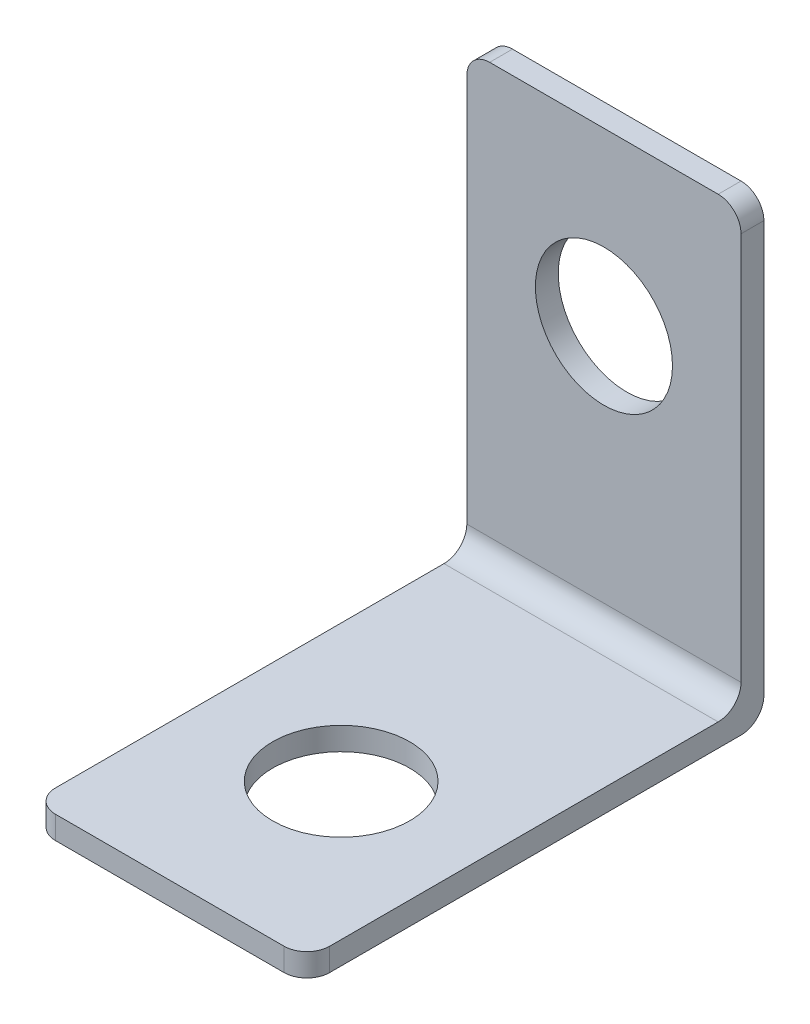
ISO-10303-21;
HEADER;
FILE_DESCRIPTION(('STEP AP214'),'2;1');
FILE_NAME('part.step','',(''),(''),'','','');
FILE_SCHEMA(('AUTOMOTIVE_DESIGN { 1 0 10303 214 1 1 1 1 }'));
ENDSEC;
DATA;
#1=APPLICATION_CONTEXT('core data for automotive mechanical design processes');
#2=APPLICATION_PROTOCOL_DEFINITION('international standard','automotive_design',2000,#1);
#3=PRODUCT_CONTEXT('',#1,'mechanical');
#4=PRODUCT('Part','Part','',(#3));
#5=PRODUCT_RELATED_PRODUCT_CATEGORY('part','',(#4));
#6=PRODUCT_DEFINITION_FORMATION('','',#4);
#7=PRODUCT_DEFINITION_CONTEXT('part definition',#1,'design');
#8=PRODUCT_DEFINITION('design','',#6,#7);
#9=PRODUCT_DEFINITION_SHAPE('','',#8);
#10=(LENGTH_UNIT() NAMED_UNIT(*) SI_UNIT(.MILLI.,.METRE.));
#11=(NAMED_UNIT(*) PLANE_ANGLE_UNIT() SI_UNIT($,.RADIAN.));
#12=(NAMED_UNIT(*) SI_UNIT($,.STERADIAN.) SOLID_ANGLE_UNIT());
#13=UNCERTAINTY_MEASURE_WITH_UNIT(LENGTH_MEASURE(1.E-05),#10,'distance_accuracy_value','');
#14=(GEOMETRIC_REPRESENTATION_CONTEXT(3) GLOBAL_UNCERTAINTY_ASSIGNED_CONTEXT((#13)) GLOBAL_UNIT_ASSIGNED_CONTEXT((#10,
#11,#12)) REPRESENTATION_CONTEXT('',''));
#15=CARTESIAN_POINT('',(0.,0.,0.));
#16=DIRECTION('',(0.,0.,1.));
#17=DIRECTION('',(1.,0.,0.));
#18=AXIS2_PLACEMENT_3D('',#15,#16,#17);
#19=CARTESIAN_POINT('',(0.,0.,1.));
#20=DIRECTION('',(0.,0.,-1.));
#21=DIRECTION('',(-1.,0.,0.));
#22=AXIS2_PLACEMENT_3D('',#19,#20,#21);
#23=PLANE('',#22);
#24=CARTESIAN_POINT('',(0.,12.5,1.));
#25=DIRECTION('',(0.,0.,1.));
#26=DIRECTION('',(1.,0.,0.));
#27=AXIS2_PLACEMENT_3D('',#24,#25,#26);
#28=CIRCLE('',#27,3.);
#29=CARTESIAN_POINT('',(3.,12.5,1.));
#30=VERTEX_POINT('',#29);
#31=EDGE_CURVE('E253',#30,#30,#28,.T.);
#32=ORIENTED_EDGE('',*,*,#31,.F.);
#33=EDGE_LOOP('',(#32));
#34=FACE_BOUND('',#33,.T.);
#35=DIRECTION('',(0.,1.,0.));
#36=VECTOR('',#35,1.);
#37=CARTESIAN_POINT('',(6.,0.,1.));
#38=LINE('',#37,#36);
#39=CARTESIAN_POINT('',(6.,2.,1.));
#40=VERTEX_POINT('',#39);
#41=CARTESIAN_POINT('',(6.,19.,1.));
#42=VERTEX_POINT('',#41);
#43=EDGE_CURVE('E264',#40,#42,#38,.T.);
#44=ORIENTED_EDGE('',*,*,#43,.T.);
#45=CARTESIAN_POINT('',(5.,19.,1.));
#46=DIRECTION('',(0.,0.,-1.));
#47=DIRECTION('',(-1.,0.,0.));
#48=AXIS2_PLACEMENT_3D('',#45,#46,#47);
#49=CIRCLE('',#48,1.);
#50=CARTESIAN_POINT('',(5.,20.,1.));
#51=VERTEX_POINT('',#50);
#52=EDGE_CURVE('E203',#42,#51,#49,.F.);
#53=ORIENTED_EDGE('',*,*,#52,.T.);
#54=DIRECTION('',(-1.,0.,0.));
#55=VECTOR('',#54,1.);
#56=CARTESIAN_POINT('',(-6.,20.,1.));
#57=LINE('',#56,#55);
#58=CARTESIAN_POINT('',(-5.,20.,1.));
#59=VERTEX_POINT('',#58);
#60=EDGE_CURVE('E269',#51,#59,#57,.T.);
#61=ORIENTED_EDGE('',*,*,#60,.T.);
#62=CARTESIAN_POINT('',(-5.,19.,1.));
#63=DIRECTION('',(0.,0.,-1.));
#64=DIRECTION('',(-1.,0.,0.));
#65=AXIS2_PLACEMENT_3D('',#62,#63,#64);
#66=CIRCLE('',#65,1.);
#67=CARTESIAN_POINT('',(-6.,19.,1.));
#68=VERTEX_POINT('',#67);
#69=EDGE_CURVE('E200',#59,#68,#66,.F.);
#70=ORIENTED_EDGE('',*,*,#69,.T.);
#71=DIRECTION('',(0.,-1.,0.));
#72=VECTOR('',#71,1.);
#73=CARTESIAN_POINT('',(-6.,0.,1.));
#74=LINE('',#73,#72);
#75=CARTESIAN_POINT('',(-6.,2.,1.));
#76=VERTEX_POINT('',#75);
#77=EDGE_CURVE('E261',#68,#76,#74,.T.);
#78=ORIENTED_EDGE('',*,*,#77,.T.);
#79=DIRECTION('',(-1.,0.,0.));
#80=VECTOR('',#79,1.);
#81=CARTESIAN_POINT('',(6.,2.,1.));
#82=LINE('',#81,#80);
#83=EDGE_CURVE('E147',#76,#40,#82,.F.);
#84=ORIENTED_EDGE('',*,*,#83,.T.);
#85=EDGE_LOOP('',(#44,#53,#61,#70,#78,#84));
#86=FACE_BOUND('',#85,.T.);
#87=ADVANCED_FACE('F39',(#34,#86),#23,.F.);
#88=CARTESIAN_POINT('',(0.,0.,0.));
#89=DIRECTION('',(0.,0.,-1.));
#90=DIRECTION('',(-1.,0.,0.));
#91=AXIS2_PLACEMENT_3D('',#88,#89,#90);
#92=PLANE('',#91);
#93=DIRECTION('',(-1.,0.,0.));
#94=VECTOR('',#93,1.);
#95=CARTESIAN_POINT('',(-6.,20.,0.));
#96=LINE('',#95,#94);
#97=CARTESIAN_POINT('',(5.,20.,0.));
#98=VERTEX_POINT('',#97);
#99=CARTESIAN_POINT('',(-5.,20.,0.));
#100=VERTEX_POINT('',#99);
#101=EDGE_CURVE('E265',#98,#100,#96,.T.);
#102=ORIENTED_EDGE('',*,*,#101,.F.);
#103=CARTESIAN_POINT('',(5.,19.,0.));
#104=DIRECTION('',(0.,0.,-1.));
#105=DIRECTION('',(-1.,0.,0.));
#106=AXIS2_PLACEMENT_3D('',#103,#104,#105);
#107=CIRCLE('',#106,1.);
#108=CARTESIAN_POINT('',(6.,19.,0.));
#109=VERTEX_POINT('',#108);
#110=EDGE_CURVE('E191',#98,#109,#107,.T.);
#111=ORIENTED_EDGE('',*,*,#110,.T.);
#112=DIRECTION('',(0.,1.,0.));
#113=VECTOR('',#112,1.);
#114=CARTESIAN_POINT('',(6.,0.,0.));
#115=LINE('',#114,#113);
#116=CARTESIAN_POINT('',(6.,1.,0.));
#117=VERTEX_POINT('',#116);
#118=EDGE_CURVE('E275',#117,#109,#115,.T.);
#119=ORIENTED_EDGE('',*,*,#118,.F.);
#120=DIRECTION('',(1.,0.,0.));
#121=VECTOR('',#120,1.);
#122=CARTESIAN_POINT('',(-6.,1.,0.));
#123=LINE('',#122,#121);
#124=CARTESIAN_POINT('',(-6.,1.,0.));
#125=VERTEX_POINT('',#124);
#126=EDGE_CURVE('E172',#117,#125,#123,.F.);
#127=ORIENTED_EDGE('',*,*,#126,.T.);
#128=DIRECTION('',(0.,-1.,0.));
#129=VECTOR('',#128,1.);
#130=CARTESIAN_POINT('',(-6.,0.,0.));
#131=LINE('',#130,#129);
#132=CARTESIAN_POINT('',(-6.,19.,0.));
#133=VERTEX_POINT('',#132);
#134=EDGE_CURVE('E257',#133,#125,#131,.T.);
#135=ORIENTED_EDGE('',*,*,#134,.F.);
#136=CARTESIAN_POINT('',(-5.,19.,0.));
#137=DIRECTION('',(0.,0.,-1.));
#138=DIRECTION('',(-1.,0.,0.));
#139=AXIS2_PLACEMENT_3D('',#136,#137,#138);
#140=CIRCLE('',#139,1.);
#141=EDGE_CURVE('E188',#133,#100,#140,.T.);
#142=ORIENTED_EDGE('',*,*,#141,.T.);
#143=EDGE_LOOP('',(#102,#111,#119,#127,#135,#142));
#144=FACE_BOUND('',#143,.T.);
#145=CARTESIAN_POINT('',(0.,12.5,0.));
#146=DIRECTION('',(0.,0.,1.));
#147=DIRECTION('',(1.,0.,0.));
#148=AXIS2_PLACEMENT_3D('',#145,#146,#147);
#149=CIRCLE('',#148,3.);
#150=CARTESIAN_POINT('',(3.,12.5,0.));
#151=VERTEX_POINT('',#150);
#152=EDGE_CURVE('E231',#151,#151,#149,.T.);
#153=ORIENTED_EDGE('',*,*,#152,.T.);
#154=EDGE_LOOP('',(#153));
#155=FACE_BOUND('',#154,.T.);
#156=ADVANCED_FACE('F292',(#144,#155),#92,.T.);
#157=CARTESIAN_POINT('',(-6.,0.,1.));
#158=DIRECTION('',(1.,0.,0.));
#159=DIRECTION('',(0.,0.,-1.));
#160=AXIS2_PLACEMENT_3D('',#157,#158,#159);
#161=PLANE('',#160);
#162=ORIENTED_EDGE('',*,*,#77,.F.);
#163=DIRECTION('',(0.,0.,-1.));
#164=VECTOR('',#163,1.);
#165=CARTESIAN_POINT('',(-6.,19.,1.));
#166=LINE('',#165,#164);
#167=EDGE_CURVE('E208',#68,#133,#166,.T.);
#168=ORIENTED_EDGE('',*,*,#167,.T.);
#169=ORIENTED_EDGE('',*,*,#134,.T.);
#170=CARTESIAN_POINT('',(-6.,1.,1.));
#171=DIRECTION('',(1.,0.,0.));
#172=DIRECTION('',(0.,0.,-1.));
#173=AXIS2_PLACEMENT_3D('',#170,#171,#172);
#174=CIRCLE('',#173,1.);
#175=CARTESIAN_POINT('',(-6.,0.,1.));
#176=VERTEX_POINT('',#175);
#177=EDGE_CURVE('E150',#125,#176,#174,.F.);
#178=ORIENTED_EDGE('',*,*,#177,.T.);
#179=DIRECTION('',(0.,0.,-1.));
#180=VECTOR('',#179,1.);
#181=CARTESIAN_POINT('',(-6.,0.,1.));
#182=LINE('',#181,#180);
#183=CARTESIAN_POINT('',(-6.,0.,19.));
#184=VERTEX_POINT('',#183);
#185=EDGE_CURVE('E156',#184,#176,#182,.T.);
#186=ORIENTED_EDGE('',*,*,#185,.F.);
#187=DIRECTION('',(0.,-1.,0.));
#188=VECTOR('',#187,1.);
#189=CARTESIAN_POINT('',(-6.,0.,19.));
#190=LINE('',#189,#188);
#191=CARTESIAN_POINT('',(-6.,1.,19.));
#192=VERTEX_POINT('',#191);
#193=EDGE_CURVE('E136',#184,#192,#190,.F.);
#194=ORIENTED_EDGE('',*,*,#193,.T.);
#195=DIRECTION('',(0.,0.,-1.));
#196=VECTOR('',#195,1.);
#197=CARTESIAN_POINT('',(-6.,1.,20.));
#198=LINE('',#197,#196);
#199=CARTESIAN_POINT('',(-6.,1.,2.));
#200=VERTEX_POINT('',#199);
#201=EDGE_CURVE('E128',#192,#200,#198,.T.);
#202=ORIENTED_EDGE('',*,*,#201,.T.);
#203=CARTESIAN_POINT('',(-6.,2.,2.));
#204=DIRECTION('',(1.,0.,0.));
#205=DIRECTION('',(0.,0.,-1.));
#206=AXIS2_PLACEMENT_3D('',#203,#204,#205);
#207=CIRCLE('',#206,1.);
#208=EDGE_CURVE('E132',#200,#76,#207,.T.);
#209=ORIENTED_EDGE('',*,*,#208,.T.);
#210=EDGE_LOOP('',(#162,#168,#169,#178,#186,#194,#202,#209));
#211=FACE_BOUND('',#210,.T.);
#212=ADVANCED_FACE('F131',(#211),#161,.F.);
#213=CARTESIAN_POINT('',(-6.,0.,1.));
#214=DIRECTION('',(0.,1.,0.));
#215=DIRECTION('',(0.,0.,1.));
#216=AXIS2_PLACEMENT_3D('',#213,#214,#215);
#217=PLANE('',#216);
#218=CARTESIAN_POINT('',(0.,0.,12.5));
#219=DIRECTION('',(0.,1.,0.));
#220=DIRECTION('',(0.,0.,1.));
#221=AXIS2_PLACEMENT_3D('',#218,#219,#220);
#222=CIRCLE('',#221,3.);
#223=CARTESIAN_POINT('',(0.,0.,15.5));
#224=VERTEX_POINT('',#223);
#225=EDGE_CURVE('E243',#224,#224,#222,.T.);
#226=ORIENTED_EDGE('',*,*,#225,.T.);
#227=EDGE_LOOP('',(#226));
#228=FACE_BOUND('',#227,.T.);
#229=DIRECTION('',(1.,0.,0.));
#230=VECTOR('',#229,1.);
#231=CARTESIAN_POINT('',(-6.,0.,20.));
#232=LINE('',#231,#230);
#233=CARTESIAN_POINT('',(-5.,0.,20.));
#234=VERTEX_POINT('',#233);
#235=CARTESIAN_POINT('',(5.,0.,20.));
#236=VERTEX_POINT('',#235);
#237=EDGE_CURVE('E238',#234,#236,#232,.T.);
#238=ORIENTED_EDGE('',*,*,#237,.F.);
#239=CARTESIAN_POINT('',(-5.,0.,19.));
#240=DIRECTION('',(0.,1.,0.));
#241=DIRECTION('',(0.,0.,1.));
#242=AXIS2_PLACEMENT_3D('',#239,#240,#241);
#243=CIRCLE('',#242,1.);
#244=EDGE_CURVE('E222',#234,#184,#243,.F.);
#245=ORIENTED_EDGE('',*,*,#244,.T.);
#246=ORIENTED_EDGE('',*,*,#185,.T.);
#247=DIRECTION('',(1.,0.,0.));
#248=VECTOR('',#247,1.);
#249=CARTESIAN_POINT('',(6.,0.,1.));
#250=LINE('',#249,#248);
#251=CARTESIAN_POINT('',(6.,0.,1.));
#252=VERTEX_POINT('',#251);
#253=EDGE_CURVE('E160',#176,#252,#250,.T.);
#254=ORIENTED_EDGE('',*,*,#253,.T.);
#255=DIRECTION('',(0.,0.,-1.));
#256=VECTOR('',#255,1.);
#257=CARTESIAN_POINT('',(6.,0.,1.));
#258=LINE('',#257,#256);
#259=CARTESIAN_POINT('',(6.,0.,19.));
#260=VERTEX_POINT('',#259);
#261=EDGE_CURVE('E162',#260,#252,#258,.T.);
#262=ORIENTED_EDGE('',*,*,#261,.F.);
#263=CARTESIAN_POINT('',(5.,0.,19.));
#264=DIRECTION('',(0.,1.,0.));
#265=DIRECTION('',(0.,0.,1.));
#266=AXIS2_PLACEMENT_3D('',#263,#264,#265);
#267=CIRCLE('',#266,1.);
#268=EDGE_CURVE('E219',#260,#236,#267,.F.);
#269=ORIENTED_EDGE('',*,*,#268,.T.);
#270=EDGE_LOOP('',(#238,#245,#246,#254,#262,#269));
#271=FACE_BOUND('',#270,.T.);
#272=ADVANCED_FACE('F237',(#228,#271),#217,.F.);
#273=CARTESIAN_POINT('',(6.,0.,1.));
#274=DIRECTION('',(-1.,0.,0.));
#275=DIRECTION('',(0.,0.,1.));
#276=AXIS2_PLACEMENT_3D('',#273,#274,#275);
#277=PLANE('',#276);
#278=ORIENTED_EDGE('',*,*,#118,.T.);
#279=DIRECTION('',(0.,0.,-1.));
#280=VECTOR('',#279,1.);
#281=CARTESIAN_POINT('',(6.,19.,1.));
#282=LINE('',#281,#280);
#283=EDGE_CURVE('E197',#109,#42,#282,.F.);
#284=ORIENTED_EDGE('',*,*,#283,.T.);
#285=ORIENTED_EDGE('',*,*,#43,.F.);
#286=CARTESIAN_POINT('',(6.,2.,2.));
#287=DIRECTION('',(-1.,0.,0.));
#288=DIRECTION('',(0.,0.,1.));
#289=AXIS2_PLACEMENT_3D('',#286,#287,#288);
#290=CIRCLE('',#289,1.);
#291=CARTESIAN_POINT('',(6.,1.,2.));
#292=VERTEX_POINT('',#291);
#293=EDGE_CURVE('E149',#40,#292,#290,.T.);
#294=ORIENTED_EDGE('',*,*,#293,.T.);
#295=DIRECTION('',(0.,0.,-1.));
#296=VECTOR('',#295,1.);
#297=CARTESIAN_POINT('',(6.,1.,20.));
#298=LINE('',#297,#296);
#299=CARTESIAN_POINT('',(6.,1.,19.));
#300=VERTEX_POINT('',#299);
#301=EDGE_CURVE('E139',#300,#292,#298,.T.);
#302=ORIENTED_EDGE('',*,*,#301,.F.);
#303=DIRECTION('',(0.,1.,0.));
#304=VECTOR('',#303,1.);
#305=CARTESIAN_POINT('',(6.,0.,19.));
#306=LINE('',#305,#304);
#307=EDGE_CURVE('E194',#300,#260,#306,.F.);
#308=ORIENTED_EDGE('',*,*,#307,.T.);
#309=ORIENTED_EDGE('',*,*,#261,.T.);
#310=CARTESIAN_POINT('',(6.,1.,1.));
#311=DIRECTION('',(-1.,0.,0.));
#312=DIRECTION('',(0.,0.,1.));
#313=AXIS2_PLACEMENT_3D('',#310,#311,#312);
#314=CIRCLE('',#313,1.);
#315=EDGE_CURVE('E169',#252,#117,#314,.F.);
#316=ORIENTED_EDGE('',*,*,#315,.T.);
#317=EDGE_LOOP('',(#278,#284,#285,#294,#302,#308,#309,#316));
#318=FACE_BOUND('',#317,.T.);
#319=ADVANCED_FACE('F227',(#318),#277,.F.);
#320=CARTESIAN_POINT('',(-6.,20.,1.));
#321=DIRECTION('',(0.,-1.,0.));
#322=DIRECTION('',(0.,0.,-1.));
#323=AXIS2_PLACEMENT_3D('',#320,#321,#322);
#324=PLANE('',#323);
#325=ORIENTED_EDGE('',*,*,#60,.F.);
#326=DIRECTION('',(0.,0.,-1.));
#327=VECTOR('',#326,1.);
#328=CARTESIAN_POINT('',(5.,20.,1.));
#329=LINE('',#328,#327);
#330=EDGE_CURVE('E184',#51,#98,#329,.T.);
#331=ORIENTED_EDGE('',*,*,#330,.T.);
#332=ORIENTED_EDGE('',*,*,#101,.T.);
#333=DIRECTION('',(0.,0.,-1.));
#334=VECTOR('',#333,1.);
#335=CARTESIAN_POINT('',(-5.,20.,1.));
#336=LINE('',#335,#334);
#337=EDGE_CURVE('E181',#100,#59,#336,.F.);
#338=ORIENTED_EDGE('',*,*,#337,.T.);
#339=EDGE_LOOP('',(#325,#331,#332,#338));
#340=FACE_BOUND('',#339,.T.);
#341=ADVANCED_FACE('F303',(#340),#324,.F.);
#342=CARTESIAN_POINT('',(0.,12.5,1.));
#343=DIRECTION('',(0.,0.,-1.));
#344=DIRECTION('',(-1.,0.,0.));
#345=AXIS2_PLACEMENT_3D('',#342,#343,#344);
#346=CYLINDRICAL_SURFACE('',#345,3.);
#347=ORIENTED_EDGE('',*,*,#31,.T.);
#348=EDGE_LOOP('',(#347));
#349=FACE_BOUND('',#348,.T.);
#350=ORIENTED_EDGE('',*,*,#152,.F.);
#351=EDGE_LOOP('',(#350));
#352=FACE_BOUND('',#351,.T.);
#353=ADVANCED_FACE('F325',(#349,#352),#346,.F.);
#354=CARTESIAN_POINT('',(-6.,1.,20.));
#355=DIRECTION('',(0.,-1.,0.));
#356=DIRECTION('',(0.,0.,-1.));
#357=AXIS2_PLACEMENT_3D('',#354,#355,#356);
#358=PLANE('',#357);
#359=CARTESIAN_POINT('',(0.,1.,12.5));
#360=DIRECTION('',(0.,1.,0.));
#361=DIRECTION('',(0.,0.,1.));
#362=AXIS2_PLACEMENT_3D('',#359,#360,#361);
#363=CIRCLE('',#362,3.);
#364=CARTESIAN_POINT('',(0.,1.,15.5));
#365=VERTEX_POINT('',#364);
#366=EDGE_CURVE('E249',#365,#365,#363,.T.);
#367=ORIENTED_EDGE('',*,*,#366,.F.);
#368=EDGE_LOOP('',(#367));
#369=FACE_BOUND('',#368,.T.);
#370=ORIENTED_EDGE('',*,*,#201,.F.);
#371=CARTESIAN_POINT('',(-5.,1.,19.));
#372=DIRECTION('',(0.,-1.,0.));
#373=DIRECTION('',(0.,0.,-1.));
#374=AXIS2_PLACEMENT_3D('',#371,#372,#373);
#375=CIRCLE('',#374,1.);
#376=CARTESIAN_POINT('',(-5.,1.,20.));
#377=VERTEX_POINT('',#376);
#378=EDGE_CURVE('E11',#192,#377,#375,.F.);
#379=ORIENTED_EDGE('',*,*,#378,.T.);
#380=DIRECTION('',(-1.,0.,0.));
#381=VECTOR('',#380,1.);
#382=CARTESIAN_POINT('',(-6.,1.,20.));
#383=LINE('',#382,#381);
#384=CARTESIAN_POINT('',(5.,1.,20.));
#385=VERTEX_POINT('',#384);
#386=EDGE_CURVE('E140',#385,#377,#383,.T.);
#387=ORIENTED_EDGE('',*,*,#386,.F.);
#388=CARTESIAN_POINT('',(5.,1.,19.));
#389=DIRECTION('',(0.,-1.,0.));
#390=DIRECTION('',(0.,0.,-1.));
#391=AXIS2_PLACEMENT_3D('',#388,#389,#390);
#392=CIRCLE('',#391,1.);
#393=EDGE_CURVE('E48',#385,#300,#392,.F.);
#394=ORIENTED_EDGE('',*,*,#393,.T.);
#395=ORIENTED_EDGE('',*,*,#301,.T.);
#396=DIRECTION('',(-1.,0.,0.));
#397=VECTOR('',#396,1.);
#398=CARTESIAN_POINT('',(-6.,1.,2.));
#399=LINE('',#398,#397);
#400=EDGE_CURVE('E146',#292,#200,#399,.T.);
#401=ORIENTED_EDGE('',*,*,#400,.T.);
#402=EDGE_LOOP('',(#370,#379,#387,#394,#395,#401));
#403=FACE_BOUND('',#402,.T.);
#404=ADVANCED_FACE('F152',(#369,#403),#358,.F.);
#405=CARTESIAN_POINT('',(0.,0.,20.));
#406=DIRECTION('',(0.,0.,-1.));
#407=DIRECTION('',(-1.,0.,0.));
#408=AXIS2_PLACEMENT_3D('',#405,#406,#407);
#409=PLANE('',#408);
#410=ORIENTED_EDGE('',*,*,#386,.T.);
#411=DIRECTION('',(0.,-1.,0.));
#412=VECTOR('',#411,1.);
#413=CARTESIAN_POINT('',(-5.,0.,20.));
#414=LINE('',#413,#412);
#415=EDGE_CURVE('E215',#377,#234,#414,.T.);
#416=ORIENTED_EDGE('',*,*,#415,.T.);
#417=ORIENTED_EDGE('',*,*,#237,.T.);
#418=DIRECTION('',(0.,1.,0.));
#419=VECTOR('',#418,1.);
#420=CARTESIAN_POINT('',(5.,0.,20.));
#421=LINE('',#420,#419);
#422=EDGE_CURVE('E212',#236,#385,#421,.T.);
#423=ORIENTED_EDGE('',*,*,#422,.T.);
#424=EDGE_LOOP('',(#410,#416,#417,#423));
#425=FACE_BOUND('',#424,.T.);
#426=ADVANCED_FACE('F240',(#425),#409,.F.);
#427=CARTESIAN_POINT('',(0.,-18.,12.5));
#428=DIRECTION('',(0.,1.,0.));
#429=DIRECTION('',(0.,0.,1.));
#430=AXIS2_PLACEMENT_3D('',#427,#428,#429);
#431=CYLINDRICAL_SURFACE('',#430,3.);
#432=ORIENTED_EDGE('',*,*,#366,.T.);
#433=EDGE_LOOP('',(#432));
#434=FACE_BOUND('',#433,.T.);
#435=ORIENTED_EDGE('',*,*,#225,.F.);
#436=EDGE_LOOP('',(#435));
#437=FACE_BOUND('',#436,.T.);
#438=ADVANCED_FACE('F339',(#434,#437),#431,.F.);
#439=CARTESIAN_POINT('',(-6.,2.,2.));
#440=DIRECTION('',(1.,0.,0.));
#441=DIRECTION('',(0.,0.,-1.));
#442=AXIS2_PLACEMENT_3D('',#439,#440,#441);
#443=CYLINDRICAL_SURFACE('',#442,1.);
#444=ORIENTED_EDGE('',*,*,#293,.F.);
#445=ORIENTED_EDGE('',*,*,#83,.F.);
#446=ORIENTED_EDGE('',*,*,#208,.F.);
#447=ORIENTED_EDGE('',*,*,#400,.F.);
#448=EDGE_LOOP('',(#444,#445,#446,#447));
#449=FACE_BOUND('',#448,.T.);
#450=ADVANCED_FACE('F145',(#449),#443,.F.);
#451=CARTESIAN_POINT('',(-6.,1.,1.));
#452=DIRECTION('',(-1.,0.,0.));
#453=DIRECTION('',(0.,0.,1.));
#454=AXIS2_PLACEMENT_3D('',#451,#452,#453);
#455=CYLINDRICAL_SURFACE('',#454,1.);
#456=ORIENTED_EDGE('',*,*,#177,.F.);
#457=ORIENTED_EDGE('',*,*,#126,.F.);
#458=ORIENTED_EDGE('',*,*,#315,.F.);
#459=ORIENTED_EDGE('',*,*,#253,.F.);
#460=EDGE_LOOP('',(#456,#457,#458,#459));
#461=FACE_BOUND('',#460,.T.);
#462=ADVANCED_FACE('F287',(#461),#455,.T.);
#463=CARTESIAN_POINT('',(5.,19.,1.));
#464=DIRECTION('',(0.,0.,-1.));
#465=DIRECTION('',(-1.,0.,0.));
#466=AXIS2_PLACEMENT_3D('',#463,#464,#465);
#467=CYLINDRICAL_SURFACE('',#466,1.);
#468=ORIENTED_EDGE('',*,*,#52,.F.);
#469=ORIENTED_EDGE('',*,*,#283,.F.);
#470=ORIENTED_EDGE('',*,*,#110,.F.);
#471=ORIENTED_EDGE('',*,*,#330,.F.);
#472=EDGE_LOOP('',(#468,#469,#470,#471));
#473=FACE_BOUND('',#472,.T.);
#474=ADVANCED_FACE('F297',(#473),#467,.T.);
#475=CARTESIAN_POINT('',(-5.,19.,1.));
#476=DIRECTION('',(0.,0.,-1.));
#477=DIRECTION('',(-1.,0.,0.));
#478=AXIS2_PLACEMENT_3D('',#475,#476,#477);
#479=CYLINDRICAL_SURFACE('',#478,1.);
#480=ORIENTED_EDGE('',*,*,#69,.F.);
#481=ORIENTED_EDGE('',*,*,#337,.F.);
#482=ORIENTED_EDGE('',*,*,#141,.F.);
#483=ORIENTED_EDGE('',*,*,#167,.F.);
#484=EDGE_LOOP('',(#480,#481,#482,#483));
#485=FACE_BOUND('',#484,.T.);
#486=ADVANCED_FACE('F306',(#485),#479,.T.);
#487=CARTESIAN_POINT('',(-5.,0.,19.));
#488=DIRECTION('',(0.,-1.,0.));
#489=DIRECTION('',(0.,0.,-1.));
#490=AXIS2_PLACEMENT_3D('',#487,#488,#489);
#491=CYLINDRICAL_SURFACE('',#490,1.);
#492=ORIENTED_EDGE('',*,*,#378,.F.);
#493=ORIENTED_EDGE('',*,*,#193,.F.);
#494=ORIENTED_EDGE('',*,*,#244,.F.);
#495=ORIENTED_EDGE('',*,*,#415,.F.);
#496=EDGE_LOOP('',(#492,#493,#494,#495));
#497=FACE_BOUND('',#496,.T.);
#498=ADVANCED_FACE('F308',(#497),#491,.T.);
#499=CARTESIAN_POINT('',(5.,0.,19.));
#500=DIRECTION('',(0.,1.,0.));
#501=DIRECTION('',(0.,0.,1.));
#502=AXIS2_PLACEMENT_3D('',#499,#500,#501);
#503=CYLINDRICAL_SURFACE('',#502,1.);
#504=ORIENTED_EDGE('',*,*,#268,.F.);
#505=ORIENTED_EDGE('',*,*,#307,.F.);
#506=ORIENTED_EDGE('',*,*,#393,.F.);
#507=ORIENTED_EDGE('',*,*,#422,.F.);
#508=EDGE_LOOP('',(#504,#505,#506,#507));
#509=FACE_BOUND('',#508,.T.);
#510=ADVANCED_FACE('F41',(#509),#503,.T.);
#511=CLOSED_SHELL('',(#87,#156,#212,#272,#319,#341,#353,#404,#426,#438,#450,#462,#474,#486,#498,#510));
#512=MANIFOLD_SOLID_BREP('B2',#511);
#513=ADVANCED_BREP_SHAPE_REPRESENTATION('',(#18,#512),#14);
#514=SHAPE_DEFINITION_REPRESENTATION(#9,#513);
ENDSEC;
END-ISO-10303-21;
